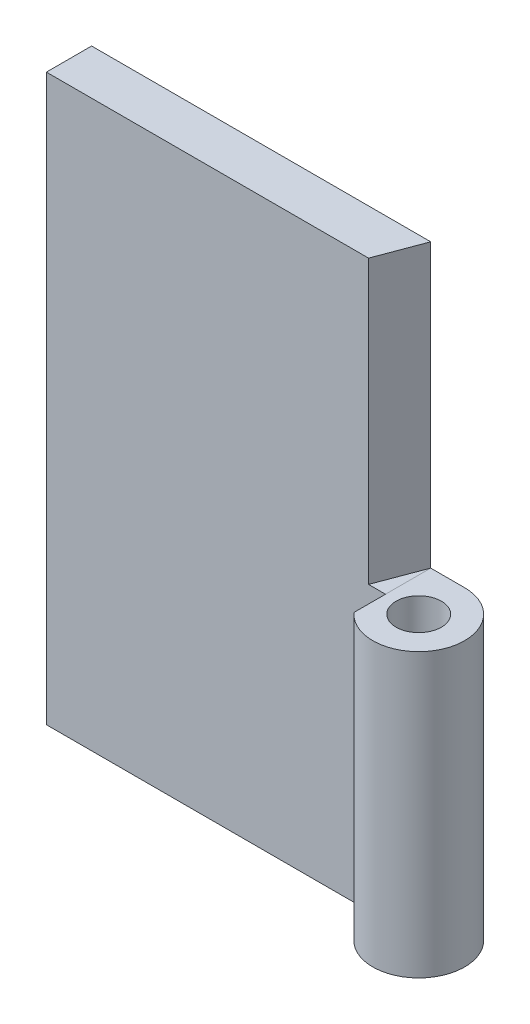
ISO-10303-21;
HEADER;
FILE_DESCRIPTION(('STEP AP214'),'2;1');
FILE_NAME('part.step','',(''),(''),'','','');
FILE_SCHEMA(('AUTOMOTIVE_DESIGN { 1 0 10303 214 1 1 1 1 }'));
ENDSEC;
DATA;
#1=APPLICATION_CONTEXT('core data for automotive mechanical design processes');
#2=APPLICATION_PROTOCOL_DEFINITION('international standard','automotive_design',2000,#1);
#3=PRODUCT_CONTEXT('',#1,'mechanical');
#4=PRODUCT('Part','Part','',(#3));
#5=PRODUCT_RELATED_PRODUCT_CATEGORY('part','',(#4));
#6=PRODUCT_DEFINITION_FORMATION('','',#4);
#7=PRODUCT_DEFINITION_CONTEXT('part definition',#1,'design');
#8=PRODUCT_DEFINITION('design','',#6,#7);
#9=PRODUCT_DEFINITION_SHAPE('','',#8);
#10=(LENGTH_UNIT() NAMED_UNIT(*) SI_UNIT(.MILLI.,.METRE.));
#11=(NAMED_UNIT(*) PLANE_ANGLE_UNIT() SI_UNIT($,.RADIAN.));
#12=(NAMED_UNIT(*) SI_UNIT($,.STERADIAN.) SOLID_ANGLE_UNIT());
#13=UNCERTAINTY_MEASURE_WITH_UNIT(LENGTH_MEASURE(1.E-05),#10,'distance_accuracy_value','');
#14=(GEOMETRIC_REPRESENTATION_CONTEXT(3) GLOBAL_UNCERTAINTY_ASSIGNED_CONTEXT((#13)) GLOBAL_UNIT_ASSIGNED_CONTEXT((#10,
#11,#12)) REPRESENTATION_CONTEXT('',''));
#15=CARTESIAN_POINT('',(0.,0.,0.));
#16=DIRECTION('',(0.,0.,1.));
#17=DIRECTION('',(1.,0.,0.));
#18=AXIS2_PLACEMENT_3D('',#15,#16,#17);
#19=CARTESIAN_POINT('',(15.,-12.5,3.4));
#20=DIRECTION('',(-1.,0.,0.));
#21=DIRECTION('',(0.,0.,1.));
#22=AXIS2_PLACEMENT_3D('',#19,#20,#21);
#23=PLANE('',#22);
#24=DIRECTION('',(0.,0.,-1.));
#25=VECTOR('',#24,1.);
#26=CARTESIAN_POINT('',(15.,-25.,3.4));
#27=LINE('',#26,#25);
#28=CARTESIAN_POINT('',(15.,-25.,3.4));
#29=VERTEX_POINT('',#28);
#30=CARTESIAN_POINT('',(15.,-25.,0.));
#31=VERTEX_POINT('',#30);
#32=EDGE_CURVE('E102',#29,#31,#27,.T.);
#33=ORIENTED_EDGE('',*,*,#32,.F.);
#34=DIRECTION('',(0.,-1.,0.));
#35=VECTOR('',#34,1.);
#36=CARTESIAN_POINT('',(15.,-12.5,3.4));
#37=LINE('',#36,#35);
#38=CARTESIAN_POINT('',(15.,-12.5,3.4));
#39=VERTEX_POINT('',#38);
#40=EDGE_CURVE('E12',#39,#29,#37,.T.);
#41=ORIENTED_EDGE('',*,*,#40,.F.);
#42=DIRECTION('',(0.,0.,-1.));
#43=VECTOR('',#42,1.);
#44=CARTESIAN_POINT('',(15.,-12.5,3.4));
#45=LINE('',#44,#43);
#46=CARTESIAN_POINT('',(15.,-12.5,0.));
#47=VERTEX_POINT('',#46);
#48=EDGE_CURVE('E91',#39,#47,#45,.T.);
#49=ORIENTED_EDGE('',*,*,#48,.T.);
#50=DIRECTION('',(0.,-1.,0.));
#51=VECTOR('',#50,1.);
#52=CARTESIAN_POINT('',(15.,-12.5,0.));
#53=LINE('',#52,#51);
#54=EDGE_CURVE('E50',#47,#31,#53,.T.);
#55=ORIENTED_EDGE('',*,*,#54,.T.);
#56=EDGE_LOOP('',(#33,#41,#49,#55));
#57=FACE_BOUND('',#56,.T.);
#58=ADVANCED_FACE('F47',(#57),#23,.T.);
#59=CARTESIAN_POINT('',(16.5,-12.5,2.03088235294118));
#60=DIRECTION('',(0.,-1.,0.));
#61=DIRECTION('',(0.,0.,-1.));
#62=AXIS2_PLACEMENT_3D('',#59,#60,#61);
#63=CYLINDRICAL_SURFACE('',#62,2.03088235294118);
#64=CARTESIAN_POINT('',(16.5,-25.,2.03088235294118));
#65=DIRECTION('',(0.,-1.,0.));
#66=DIRECTION('',(0.,0.,-1.));
#67=AXIS2_PLACEMENT_3D('',#64,#65,#66);
#68=CIRCLE('',#67,2.03088235294118);
#69=CARTESIAN_POINT('',(16.5,-25.,0.));
#70=VERTEX_POINT('',#69);
#71=EDGE_CURVE('E93',#70,#29,#68,.T.);
#72=ORIENTED_EDGE('',*,*,#71,.F.);
#73=DIRECTION('',(0.,-1.,0.));
#74=VECTOR('',#73,1.);
#75=CARTESIAN_POINT('',(16.5,-12.5,0.));
#76=LINE('',#75,#74);
#77=CARTESIAN_POINT('',(16.5,-12.5,0.));
#78=VERTEX_POINT('',#77);
#79=EDGE_CURVE('E56',#78,#70,#76,.T.);
#80=ORIENTED_EDGE('',*,*,#79,.F.);
#81=CARTESIAN_POINT('',(16.5,-12.5,2.03088235294118));
#82=DIRECTION('',(0.,-1.,0.));
#83=DIRECTION('',(0.,0.,-1.));
#84=AXIS2_PLACEMENT_3D('',#81,#82,#83);
#85=CIRCLE('',#84,2.03088235294118);
#86=EDGE_CURVE('E88',#78,#39,#85,.T.);
#87=ORIENTED_EDGE('',*,*,#86,.T.);
#88=ORIENTED_EDGE('',*,*,#40,.T.);
#89=EDGE_LOOP('',(#72,#80,#87,#88));
#90=FACE_BOUND('',#89,.T.);
#91=ADVANCED_FACE('F106',(#90),#63,.T.);
#92=CARTESIAN_POINT('',(15.,-12.5,0.));
#93=DIRECTION('',(0.,0.,-1.));
#94=DIRECTION('',(-1.,0.,0.));
#95=AXIS2_PLACEMENT_3D('',#92,#93,#94);
#96=PLANE('',#95);
#97=DIRECTION('',(1.,0.,0.));
#98=VECTOR('',#97,1.);
#99=CARTESIAN_POINT('',(15.,-25.,0.));
#100=LINE('',#99,#98);
#101=EDGE_CURVE('E86',#31,#70,#100,.T.);
#102=ORIENTED_EDGE('',*,*,#101,.F.);
#103=ORIENTED_EDGE('',*,*,#54,.F.);
#104=DIRECTION('',(1.,0.,0.));
#105=VECTOR('',#104,1.);
#106=CARTESIAN_POINT('',(15.,-12.5,0.));
#107=LINE('',#106,#105);
#108=EDGE_CURVE('E84',#47,#78,#107,.T.);
#109=ORIENTED_EDGE('',*,*,#108,.T.);
#110=ORIENTED_EDGE('',*,*,#79,.T.);
#111=EDGE_LOOP('',(#102,#103,#109,#110));
#112=FACE_BOUND('',#111,.T.);
#113=ADVANCED_FACE('F83',(#112),#96,.T.);
#114=CARTESIAN_POINT('',(16.5,-12.5,2.03088235294118));
#115=DIRECTION('',(0.,-1.,0.));
#116=DIRECTION('',(0.,0.,-1.));
#117=AXIS2_PLACEMENT_3D('',#114,#115,#116);
#118=PLANE('',#117);
#119=CARTESIAN_POINT('',(16.5,-12.5,2.03088235294118));
#120=DIRECTION('',(0.,-1.,0.));
#121=DIRECTION('',(0.,0.,-1.));
#122=AXIS2_PLACEMENT_3D('',#119,#120,#121);
#123=CIRCLE('',#122,1.);
#124=CARTESIAN_POINT('',(16.5,-12.5,1.03088235294118));
#125=VERTEX_POINT('',#124);
#126=EDGE_CURVE('E98',#125,#125,#123,.T.);
#127=ORIENTED_EDGE('',*,*,#126,.T.);
#128=EDGE_LOOP('',(#127));
#129=FACE_BOUND('',#128,.T.);
#130=ORIENTED_EDGE('',*,*,#48,.F.);
#131=ORIENTED_EDGE('',*,*,#86,.F.);
#132=ORIENTED_EDGE('',*,*,#108,.F.);
#133=EDGE_LOOP('',(#130,#131,#132));
#134=FACE_BOUND('',#133,.T.);
#135=ADVANCED_FACE('F90',(#129,#134),#118,.F.);
#136=CARTESIAN_POINT('',(16.5,-25.,2.03088235294118));
#137=DIRECTION('',(0.,-1.,0.));
#138=DIRECTION('',(0.,0.,-1.));
#139=AXIS2_PLACEMENT_3D('',#136,#137,#138);
#140=PLANE('',#139);
#141=CARTESIAN_POINT('',(16.5,-25.,2.03088235294118));
#142=DIRECTION('',(0.,-1.,0.));
#143=DIRECTION('',(0.,0.,-1.));
#144=AXIS2_PLACEMENT_3D('',#141,#142,#143);
#145=CIRCLE('',#144,1.);
#146=CARTESIAN_POINT('',(16.5,-25.,1.03088235294118));
#147=VERTEX_POINT('',#146);
#148=EDGE_CURVE('E128',#147,#147,#145,.T.);
#149=ORIENTED_EDGE('',*,*,#148,.F.);
#150=EDGE_LOOP('',(#149));
#151=FACE_BOUND('',#150,.T.);
#152=ORIENTED_EDGE('',*,*,#32,.T.);
#153=ORIENTED_EDGE('',*,*,#101,.T.);
#154=ORIENTED_EDGE('',*,*,#71,.T.);
#155=EDGE_LOOP('',(#152,#153,#154));
#156=FACE_BOUND('',#155,.T.);
#157=ADVANCED_FACE('F105',(#151,#156),#140,.T.);
#158=CARTESIAN_POINT('',(16.5,0.,2.03088235294118));
#159=DIRECTION('',(0.,-1.,0.));
#160=DIRECTION('',(0.,0.,-1.));
#161=AXIS2_PLACEMENT_3D('',#158,#159,#160);
#162=CYLINDRICAL_SURFACE('',#161,1.);
#163=ORIENTED_EDGE('',*,*,#148,.T.);
#164=EDGE_LOOP('',(#163));
#165=FACE_BOUND('',#164,.T.);
#166=ORIENTED_EDGE('',*,*,#126,.F.);
#167=EDGE_LOOP('',(#166));
#168=FACE_BOUND('',#167,.T.);
#169=ADVANCED_FACE('F116',(#165,#168),#162,.F.);
#170=CLOSED_SHELL('',(#58,#91,#113,#135,#157,#169));
#171=MANIFOLD_SOLID_BREP('B2',#170);
#172=CARTESIAN_POINT('',(0.,0.,2.));
#173=DIRECTION('',(1.,0.,0.));
#174=DIRECTION('',(0.,1.,0.));
#175=AXIS2_PLACEMENT_3D('',#172,#173,#174);
#176=PLANE('',#175);
#177=DIRECTION('',(0.,-1.,0.));
#178=VECTOR('',#177,1.);
#179=CARTESIAN_POINT('',(0.,0.,0.));
#180=LINE('',#179,#178);
#181=CARTESIAN_POINT('',(0.,0.,0.));
#182=VERTEX_POINT('',#181);
#183=CARTESIAN_POINT('',(0.,-25.,0.));
#184=VERTEX_POINT('',#183);
#185=EDGE_CURVE('E245',#182,#184,#180,.T.);
#186=ORIENTED_EDGE('',*,*,#185,.T.);
#187=DIRECTION('',(0.,0.,-1.));
#188=VECTOR('',#187,1.);
#189=CARTESIAN_POINT('',(0.,-25.,2.));
#190=LINE('',#189,#188);
#191=CARTESIAN_POINT('',(0.,-25.,2.));
#192=VERTEX_POINT('',#191);
#193=EDGE_CURVE('E45',#192,#184,#190,.T.);
#194=ORIENTED_EDGE('',*,*,#193,.F.);
#195=DIRECTION('',(0.,-1.,0.));
#196=VECTOR('',#195,1.);
#197=CARTESIAN_POINT('',(0.,0.,2.));
#198=LINE('',#197,#196);
#199=CARTESIAN_POINT('',(0.,0.,2.));
#200=VERTEX_POINT('',#199);
#201=EDGE_CURVE('E253',#200,#192,#198,.T.);
#202=ORIENTED_EDGE('',*,*,#201,.F.);
#203=DIRECTION('',(0.,0.,-1.));
#204=VECTOR('',#203,1.);
#205=CARTESIAN_POINT('',(0.,0.,2.));
#206=LINE('',#205,#204);
#207=EDGE_CURVE('E237',#200,#182,#206,.T.);
#208=ORIENTED_EDGE('',*,*,#207,.T.);
#209=EDGE_LOOP('',(#186,#194,#202,#208));
#210=FACE_BOUND('',#209,.T.);
#211=ADVANCED_FACE('F166',(#210),#176,.F.);
#212=CARTESIAN_POINT('',(0.,-25.,2.));
#213=DIRECTION('',(0.,1.,0.));
#214=DIRECTION('',(0.,0.,1.));
#215=AXIS2_PLACEMENT_3D('',#212,#213,#214);
#216=PLANE('',#215);
#217=DIRECTION('',(1.,0.,0.));
#218=VECTOR('',#217,1.);
#219=CARTESIAN_POINT('',(0.,-25.,0.));
#220=LINE('',#219,#218);
#221=CARTESIAN_POINT('',(15.,-25.,0.));
#222=VERTEX_POINT('',#221);
#223=EDGE_CURVE('E248',#184,#222,#220,.T.);
#224=ORIENTED_EDGE('',*,*,#223,.T.);
#225=DIRECTION('',(0.,0.,-1.));
#226=VECTOR('',#225,1.);
#227=CARTESIAN_POINT('',(15.,-25.,2.));
#228=LINE('',#227,#226);
#229=CARTESIAN_POINT('',(15.,-25.,2.));
#230=VERTEX_POINT('',#229);
#231=EDGE_CURVE('E173',#230,#222,#228,.T.);
#232=ORIENTED_EDGE('',*,*,#231,.F.);
#233=DIRECTION('',(1.,0.,0.));
#234=VECTOR('',#233,1.);
#235=CARTESIAN_POINT('',(0.,-25.,2.));
#236=LINE('',#235,#234);
#237=EDGE_CURVE('E212',#192,#230,#236,.T.);
#238=ORIENTED_EDGE('',*,*,#237,.F.);
#239=ORIENTED_EDGE('',*,*,#193,.T.);
#240=EDGE_LOOP('',(#224,#232,#238,#239));
#241=FACE_BOUND('',#240,.T.);
#242=ADVANCED_FACE('F268',(#241),#216,.F.);
#243=CARTESIAN_POINT('',(15.,0.,2.));
#244=DIRECTION('',(-1.,0.,0.));
#245=DIRECTION('',(0.,-1.,0.));
#246=AXIS2_PLACEMENT_3D('',#243,#244,#245);
#247=PLANE('',#246);
#248=DIRECTION('',(0.,1.,0.));
#249=VECTOR('',#248,1.);
#250=CARTESIAN_POINT('',(15.,0.,0.));
#251=LINE('',#250,#249);
#252=CARTESIAN_POINT('',(15.,-12.5,0.));
#253=VERTEX_POINT('',#252);
#254=EDGE_CURVE('E250',#222,#253,#251,.T.);
#255=ORIENTED_EDGE('',*,*,#254,.T.);
#256=DIRECTION('',(0.,0.,-1.));
#257=VECTOR('',#256,1.);
#258=CARTESIAN_POINT('',(15.,-12.5,2.));
#259=LINE('',#258,#257);
#260=CARTESIAN_POINT('',(15.,-12.5,2.));
#261=VERTEX_POINT('',#260);
#262=EDGE_CURVE('E180',#261,#253,#259,.T.);
#263=ORIENTED_EDGE('',*,*,#262,.F.);
#264=DIRECTION('',(0.,1.,0.));
#265=VECTOR('',#264,1.);
#266=CARTESIAN_POINT('',(15.,0.,2.));
#267=LINE('',#266,#265);
#268=EDGE_CURVE('E239',#230,#261,#267,.T.);
#269=ORIENTED_EDGE('',*,*,#268,.F.);
#270=ORIENTED_EDGE('',*,*,#231,.T.);
#271=EDGE_LOOP('',(#255,#263,#269,#270));
#272=FACE_BOUND('',#271,.T.);
#273=ADVANCED_FACE('F258',(#272),#247,.F.);
#274=CARTESIAN_POINT('',(0.,0.,2.));
#275=DIRECTION('',(0.,-1.,0.));
#276=DIRECTION('',(0.,0.,-1.));
#277=AXIS2_PLACEMENT_3D('',#274,#275,#276);
#278=PLANE('',#277);
#279=DIRECTION('',(-1.,0.,0.));
#280=VECTOR('',#279,1.);
#281=CARTESIAN_POINT('',(0.,0.,2.));
#282=LINE('',#281,#280);
#283=CARTESIAN_POINT('',(14.25,0.,2.));
#284=VERTEX_POINT('',#283);
#285=EDGE_CURVE('E189',#284,#200,#282,.T.);
#286=ORIENTED_EDGE('',*,*,#285,.F.);
#287=DIRECTION('',(-0.351123441588392,0.,0.936329177569045));
#288=VECTOR('',#287,1.);
#289=CARTESIAN_POINT('',(15.,0.,0.));
#290=LINE('',#289,#288);
#291=CARTESIAN_POINT('',(15.,0.,0.));
#292=VERTEX_POINT('',#291);
#293=EDGE_CURVE('E224',#292,#284,#290,.T.);
#294=ORIENTED_EDGE('',*,*,#293,.F.);
#295=DIRECTION('',(-1.,0.,0.));
#296=VECTOR('',#295,1.);
#297=CARTESIAN_POINT('',(0.,0.,0.));
#298=LINE('',#297,#296);
#299=EDGE_CURVE('E207',#292,#182,#298,.T.);
#300=ORIENTED_EDGE('',*,*,#299,.T.);
#301=ORIENTED_EDGE('',*,*,#207,.F.);
#302=EDGE_LOOP('',(#286,#294,#300,#301));
#303=FACE_BOUND('',#302,.T.);
#304=ADVANCED_FACE('F236',(#303),#278,.F.);
#305=CARTESIAN_POINT('',(0.,0.,2.));
#306=DIRECTION('',(0.,0.,1.));
#307=DIRECTION('',(1.,0.,0.));
#308=AXIS2_PLACEMENT_3D('',#305,#306,#307);
#309=PLANE('',#308);
#310=DIRECTION('',(1.,0.,0.));
#311=VECTOR('',#310,1.);
#312=CARTESIAN_POINT('',(14.25,-12.5,2.));
#313=LINE('',#312,#311);
#314=CARTESIAN_POINT('',(14.25,-12.5,2.));
#315=VERTEX_POINT('',#314);
#316=EDGE_CURVE('E233',#315,#261,#313,.T.);
#317=ORIENTED_EDGE('',*,*,#316,.F.);
#318=DIRECTION('',(0.,1.,0.));
#319=VECTOR('',#318,1.);
#320=CARTESIAN_POINT('',(14.25,-14.6360009363294,2.));
#321=LINE('',#320,#319);
#322=EDGE_CURVE('E226',#315,#284,#321,.T.);
#323=ORIENTED_EDGE('',*,*,#322,.T.);
#324=ORIENTED_EDGE('',*,*,#285,.T.);
#325=ORIENTED_EDGE('',*,*,#201,.T.);
#326=ORIENTED_EDGE('',*,*,#237,.T.);
#327=ORIENTED_EDGE('',*,*,#268,.T.);
#328=EDGE_LOOP('',(#317,#323,#324,#325,#326,#327));
#329=FACE_BOUND('',#328,.T.);
#330=ADVANCED_FACE('F231',(#329),#309,.T.);
#331=CARTESIAN_POINT('',(0.,0.,0.));
#332=DIRECTION('',(0.,0.,1.));
#333=DIRECTION('',(1.,0.,0.));
#334=AXIS2_PLACEMENT_3D('',#331,#332,#333);
#335=PLANE('',#334);
#336=ORIENTED_EDGE('',*,*,#185,.F.);
#337=ORIENTED_EDGE('',*,*,#299,.F.);
#338=DIRECTION('',(0.,1.,0.));
#339=VECTOR('',#338,1.);
#340=CARTESIAN_POINT('',(15.,-14.6360009363294,0.));
#341=LINE('',#340,#339);
#342=EDGE_CURVE('E228',#253,#292,#341,.T.);
#343=ORIENTED_EDGE('',*,*,#342,.F.);
#344=ORIENTED_EDGE('',*,*,#254,.F.);
#345=ORIENTED_EDGE('',*,*,#223,.F.);
#346=EDGE_LOOP('',(#336,#337,#343,#344,#345));
#347=FACE_BOUND('',#346,.T.);
#348=ADVANCED_FACE('F261',(#347),#335,.F.);
#349=CARTESIAN_POINT('',(16.5,-12.5,2.03088235294118));
#350=DIRECTION('',(0.,-1.,0.));
#351=DIRECTION('',(0.,0.,-1.));
#352=AXIS2_PLACEMENT_3D('',#349,#350,#351);
#353=PLANE('',#352);
#354=ORIENTED_EDGE('',*,*,#316,.T.);
#355=ORIENTED_EDGE('',*,*,#262,.T.);
#356=DIRECTION('',(-0.351123441588392,0.,0.936329177569045));
#357=VECTOR('',#356,1.);
#358=CARTESIAN_POINT('',(15.,-12.5,0.));
#359=LINE('',#358,#357);
#360=EDGE_CURVE('E234',#253,#315,#359,.T.);
#361=ORIENTED_EDGE('',*,*,#360,.T.);
#362=EDGE_LOOP('',(#354,#355,#361));
#363=FACE_BOUND('',#362,.T.);
#364=ADVANCED_FACE('F280',(#363),#353,.F.);
#365=CARTESIAN_POINT('',(15.,-14.6360009363294,0.));
#366=DIRECTION('',(-0.936329177569045,0.,-0.351123441588392));
#367=DIRECTION('',(-0.351123441588392,0.,0.936329177569045));
#368=AXIS2_PLACEMENT_3D('',#365,#366,#367);
#369=PLANE('',#368);
#370=ORIENTED_EDGE('',*,*,#342,.T.);
#371=ORIENTED_EDGE('',*,*,#293,.T.);
#372=ORIENTED_EDGE('',*,*,#322,.F.);
#373=ORIENTED_EDGE('',*,*,#360,.F.);
#374=EDGE_LOOP('',(#370,#371,#372,#373));
#375=FACE_BOUND('',#374,.T.);
#376=ADVANCED_FACE('F225',(#375),#369,.F.);
#377=CLOSED_SHELL('',(#211,#242,#273,#304,#330,#348,#364,#376));
#378=MANIFOLD_SOLID_BREP('B6',#377);
#379=ADVANCED_BREP_SHAPE_REPRESENTATION('',(#18,#171,#378),#14);
#380=SHAPE_DEFINITION_REPRESENTATION(#9,#379);
ENDSEC;
END-ISO-10303-21;
